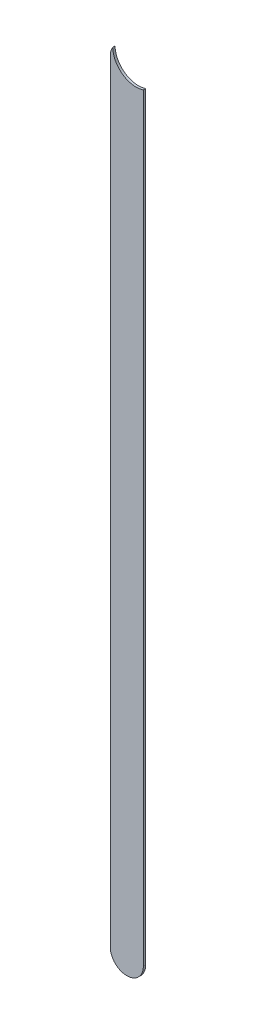
ISO-10303-21;
HEADER;
FILE_DESCRIPTION(('STEP AP214'),'2;1');
FILE_NAME('part.step','',(''),(''),'','','');
FILE_SCHEMA(('AUTOMOTIVE_DESIGN { 1 0 10303 214 1 1 1 1 }'));
ENDSEC;
DATA;
#1=APPLICATION_CONTEXT('core data for automotive mechanical design processes');
#2=APPLICATION_PROTOCOL_DEFINITION('international standard','automotive_design',2000,#1);
#3=PRODUCT_CONTEXT('',#1,'mechanical');
#4=PRODUCT('Part','Part','',(#3));
#5=PRODUCT_RELATED_PRODUCT_CATEGORY('part','',(#4));
#6=PRODUCT_DEFINITION_FORMATION('','',#4);
#7=PRODUCT_DEFINITION_CONTEXT('part definition',#1,'design');
#8=PRODUCT_DEFINITION('design','',#6,#7);
#9=PRODUCT_DEFINITION_SHAPE('','',#8);
#10=(LENGTH_UNIT() NAMED_UNIT(*) SI_UNIT(.MILLI.,.METRE.));
#11=(NAMED_UNIT(*) PLANE_ANGLE_UNIT() SI_UNIT($,.RADIAN.));
#12=(NAMED_UNIT(*) SI_UNIT($,.STERADIAN.) SOLID_ANGLE_UNIT());
#13=UNCERTAINTY_MEASURE_WITH_UNIT(LENGTH_MEASURE(1.E-05),#10,'distance_accuracy_value','');
#14=(GEOMETRIC_REPRESENTATION_CONTEXT(3) GLOBAL_UNCERTAINTY_ASSIGNED_CONTEXT((#13)) GLOBAL_UNIT_ASSIGNED_CONTEXT((#10,
#11,#12)) REPRESENTATION_CONTEXT('',''));
#15=CARTESIAN_POINT('',(0.,0.,0.));
#16=DIRECTION('',(0.,0.,1.));
#17=DIRECTION('',(1.,0.,0.));
#18=AXIS2_PLACEMENT_3D('',#15,#16,#17);
#19=CARTESIAN_POINT('',(89.14823166,93.99823212,0.));
#20=DIRECTION('',(-1.,0.,0.));
#21=DIRECTION('',(0.,1.,0.));
#22=AXIS2_PLACEMENT_3D('',#19,#20,#21);
#23=PLANE('',#22);
#24=DIRECTION('',(0.,1.,0.));
#25=VECTOR('',#24,1.);
#26=CARTESIAN_POINT('',(89.14823166,93.99823212,0.03556));
#27=LINE('',#26,#25);
#28=CARTESIAN_POINT('',(89.14823166,93.99823212,0.03556));
#29=VERTEX_POINT('',#28);
#30=CARTESIAN_POINT('',(89.14823166,105.479364186886,0.03556));
#31=VERTEX_POINT('',#30);
#32=EDGE_CURVE('E11',#29,#31,#27,.T.);
#33=ORIENTED_EDGE('',*,*,#32,.F.);
#34=DIRECTION('',(0.,0.,1.));
#35=VECTOR('',#34,1.);
#36=CARTESIAN_POINT('',(89.14823166,93.99823212,0.));
#37=LINE('',#36,#35);
#38=CARTESIAN_POINT('',(89.14823166,93.99823212,0.));
#39=VERTEX_POINT('',#38);
#40=EDGE_CURVE('E24',#39,#29,#37,.T.);
#41=ORIENTED_EDGE('',*,*,#40,.F.);
#42=DIRECTION('',(0.,1.,0.));
#43=VECTOR('',#42,1.);
#44=CARTESIAN_POINT('',(89.14823166,93.99823212,0.));
#45=LINE('',#44,#43);
#46=CARTESIAN_POINT('',(89.14823166,105.479364186886,0.));
#47=VERTEX_POINT('',#46);
#48=EDGE_CURVE('E82',#39,#47,#45,.T.);
#49=ORIENTED_EDGE('',*,*,#48,.T.);
#50=DIRECTION('',(0.,0.,1.));
#51=VECTOR('',#50,1.);
#52=CARTESIAN_POINT('',(89.14823166,105.479364186886,0.));
#53=LINE('',#52,#51);
#54=EDGE_CURVE('E37',#47,#31,#53,.T.);
#55=ORIENTED_EDGE('',*,*,#54,.T.);
#56=EDGE_LOOP('',(#33,#41,#49,#55));
#57=FACE_BOUND('',#56,.T.);
#58=ADVANCED_FACE('F17',(#57),#23,.F.);
#59=CARTESIAN_POINT('',(89.03899896,105.8177716,0.));
#60=DIRECTION('',(0.,0.,-1.));
#61=DIRECTION('',(1.,0.,0.));
#62=AXIS2_PLACEMENT_3D('',#59,#60,#61);
#63=CYLINDRICAL_SURFACE('',#62,0.3556);
#64=DIRECTION('',(0.,0.,1.));
#65=VECTOR('',#64,1.);
#66=CARTESIAN_POINT('',(88.6836202249518,105.805229085278,0.));
#67=LINE('',#66,#65);
#68=CARTESIAN_POINT('',(88.6836202249518,105.805229085278,0.));
#69=VERTEX_POINT('',#68);
#70=CARTESIAN_POINT('',(88.6836202249518,105.805229085278,0.03556));
#71=VERTEX_POINT('',#70);
#72=EDGE_CURVE('E98',#69,#71,#67,.T.);
#73=ORIENTED_EDGE('',*,*,#72,.T.);
#74=CARTESIAN_POINT('',(89.03899896,105.8177716,0.03556));
#75=DIRECTION('',(0.,0.,1.));
#76=DIRECTION('',(1.,0.,0.));
#77=AXIS2_PLACEMENT_3D('',#74,#75,#76);
#78=CIRCLE('',#77,0.3556);
#79=EDGE_CURVE('E95',#71,#31,#78,.T.);
#80=ORIENTED_EDGE('',*,*,#79,.T.);
#81=ORIENTED_EDGE('',*,*,#54,.F.);
#82=CARTESIAN_POINT('',(89.03899896,105.8177716,0.));
#83=DIRECTION('',(0.,0.,1.));
#84=DIRECTION('',(1.,0.,0.));
#85=AXIS2_PLACEMENT_3D('',#82,#83,#84);
#86=CIRCLE('',#85,0.3556);
#87=EDGE_CURVE('E93',#69,#47,#86,.T.);
#88=ORIENTED_EDGE('',*,*,#87,.F.);
#89=EDGE_LOOP('',(#73,#80,#81,#88));
#90=FACE_BOUND('',#89,.T.);
#91=ADVANCED_FACE('F103',(#90),#63,.F.);
#92=CARTESIAN_POINT('',(88.89823216,105.6770048,0.));
#93=DIRECTION('',(0.,0.,-1.));
#94=DIRECTION('',(1.,0.,0.));
#95=AXIS2_PLACEMENT_3D('',#92,#93,#94);
#96=CYLINDRICAL_SURFACE('',#95,0.249999500000011);
#97=CARTESIAN_POINT('',(88.89823216,105.6770048,0.03556));
#98=DIRECTION('',(0.,0.,1.));
#99=DIRECTION('',(1.,0.,0.));
#100=AXIS2_PLACEMENT_3D('',#97,#98,#99);
#101=CIRCLE('',#100,0.249999500000011);
#102=CARTESIAN_POINT('',(88.64823266,105.6770048,0.03556));
#103=VERTEX_POINT('',#102);
#104=EDGE_CURVE('E90',#71,#103,#101,.T.);
#105=ORIENTED_EDGE('',*,*,#104,.F.);
#106=ORIENTED_EDGE('',*,*,#72,.F.);
#107=CARTESIAN_POINT('',(88.89823216,105.6770048,0.));
#108=DIRECTION('',(0.,0.,1.));
#109=DIRECTION('',(1.,0.,0.));
#110=AXIS2_PLACEMENT_3D('',#107,#108,#109);
#111=CIRCLE('',#110,0.249999500000011);
#112=CARTESIAN_POINT('',(88.64823266,105.6770048,0.));
#113=VERTEX_POINT('',#112);
#114=EDGE_CURVE('E88',#69,#113,#111,.T.);
#115=ORIENTED_EDGE('',*,*,#114,.T.);
#116=DIRECTION('',(0.,0.,1.));
#117=VECTOR('',#116,1.);
#118=CARTESIAN_POINT('',(88.64823266,105.6770048,0.));
#119=LINE('',#118,#117);
#120=EDGE_CURVE('E73',#113,#103,#119,.T.);
#121=ORIENTED_EDGE('',*,*,#120,.T.);
#122=EDGE_LOOP('',(#105,#106,#115,#121));
#123=FACE_BOUND('',#122,.T.);
#124=ADVANCED_FACE('F109',(#123),#96,.T.);
#125=CARTESIAN_POINT('',(88.64823266,105.6770048,0.));
#126=DIRECTION('',(1.,0.,0.));
#127=DIRECTION('',(0.,-1.,0.));
#128=AXIS2_PLACEMENT_3D('',#125,#126,#127);
#129=PLANE('',#128);
#130=DIRECTION('',(0.,-1.,0.));
#131=VECTOR('',#130,1.);
#132=CARTESIAN_POINT('',(88.64823266,105.6770048,0.03556));
#133=LINE('',#132,#131);
#134=CARTESIAN_POINT('',(88.64823266,93.99823212,0.03556));
#135=VERTEX_POINT('',#134);
#136=EDGE_CURVE('E77',#103,#135,#133,.T.);
#137=ORIENTED_EDGE('',*,*,#136,.F.);
#138=ORIENTED_EDGE('',*,*,#120,.F.);
#139=DIRECTION('',(0.,-1.,0.));
#140=VECTOR('',#139,1.);
#141=CARTESIAN_POINT('',(88.64823266,105.6770048,0.));
#142=LINE('',#141,#140);
#143=CARTESIAN_POINT('',(88.64823266,93.99823212,0.));
#144=VERTEX_POINT('',#143);
#145=EDGE_CURVE('E69',#113,#144,#142,.T.);
#146=ORIENTED_EDGE('',*,*,#145,.T.);
#147=DIRECTION('',(0.,0.,1.));
#148=VECTOR('',#147,1.);
#149=CARTESIAN_POINT('',(88.64823266,93.99823212,0.));
#150=LINE('',#149,#148);
#151=EDGE_CURVE('E59',#144,#135,#150,.T.);
#152=ORIENTED_EDGE('',*,*,#151,.T.);
#153=EDGE_LOOP('',(#137,#138,#146,#152));
#154=FACE_BOUND('',#153,.T.);
#155=ADVANCED_FACE('F72',(#154),#129,.F.);
#156=CARTESIAN_POINT('',(88.89823216,93.99823212,0.));
#157=DIRECTION('',(0.,0.,-1.));
#158=DIRECTION('',(-1.,0.,0.));
#159=AXIS2_PLACEMENT_3D('',#156,#157,#158);
#160=CYLINDRICAL_SURFACE('',#159,0.249999500000006);
#161=CARTESIAN_POINT('',(88.89823216,93.99823212,0.03556));
#162=DIRECTION('',(0.,0.,1.));
#163=DIRECTION('',(-1.,0.,0.));
#164=AXIS2_PLACEMENT_3D('',#161,#162,#163);
#165=CIRCLE('',#164,0.249999500000006);
#166=EDGE_CURVE('E65',#135,#29,#165,.T.);
#167=ORIENTED_EDGE('',*,*,#166,.F.);
#168=ORIENTED_EDGE('',*,*,#151,.F.);
#169=CARTESIAN_POINT('',(88.89823216,93.99823212,0.));
#170=DIRECTION('',(0.,0.,1.));
#171=DIRECTION('',(-1.,0.,0.));
#172=AXIS2_PLACEMENT_3D('',#169,#170,#171);
#173=CIRCLE('',#172,0.249999500000006);
#174=EDGE_CURVE('E63',#144,#39,#173,.T.);
#175=ORIENTED_EDGE('',*,*,#174,.T.);
#176=ORIENTED_EDGE('',*,*,#40,.T.);
#177=EDGE_LOOP('',(#167,#168,#175,#176));
#178=FACE_BOUND('',#177,.T.);
#179=ADVANCED_FACE('F61',(#178),#160,.T.);
#180=CARTESIAN_POINT('',(89.14823166,93.99823212,0.));
#181=DIRECTION('',(0.,0.,-1.));
#182=DIRECTION('',(-1.,0.,0.));
#183=AXIS2_PLACEMENT_3D('',#180,#181,#182);
#184=PLANE('',#183);
#185=ORIENTED_EDGE('',*,*,#48,.F.);
#186=ORIENTED_EDGE('',*,*,#174,.F.);
#187=ORIENTED_EDGE('',*,*,#145,.F.);
#188=ORIENTED_EDGE('',*,*,#114,.F.);
#189=ORIENTED_EDGE('',*,*,#87,.T.);
#190=EDGE_LOOP('',(#185,#186,#187,#188,#189));
#191=FACE_BOUND('',#190,.T.);
#192=ADVANCED_FACE('F80',(#191),#184,.T.);
#193=CARTESIAN_POINT('',(89.14823166,93.99823212,0.03556));
#194=DIRECTION('',(0.,0.,-1.));
#195=DIRECTION('',(-1.,0.,0.));
#196=AXIS2_PLACEMENT_3D('',#193,#194,#195);
#197=PLANE('',#196);
#198=ORIENTED_EDGE('',*,*,#166,.T.);
#199=ORIENTED_EDGE('',*,*,#32,.T.);
#200=ORIENTED_EDGE('',*,*,#79,.F.);
#201=ORIENTED_EDGE('',*,*,#104,.T.);
#202=ORIENTED_EDGE('',*,*,#136,.T.);
#203=EDGE_LOOP('',(#198,#199,#200,#201,#202));
#204=FACE_BOUND('',#203,.T.);
#205=ADVANCED_FACE('F107',(#204),#197,.F.);
#206=CLOSED_SHELL('',(#58,#91,#124,#155,#179,#192,#205));
#207=MANIFOLD_SOLID_BREP('B1',#206);
#208=ADVANCED_BREP_SHAPE_REPRESENTATION('',(#18,#207),#14);
#209=SHAPE_DEFINITION_REPRESENTATION(#9,#208);
ENDSEC;
END-ISO-10303-21;
